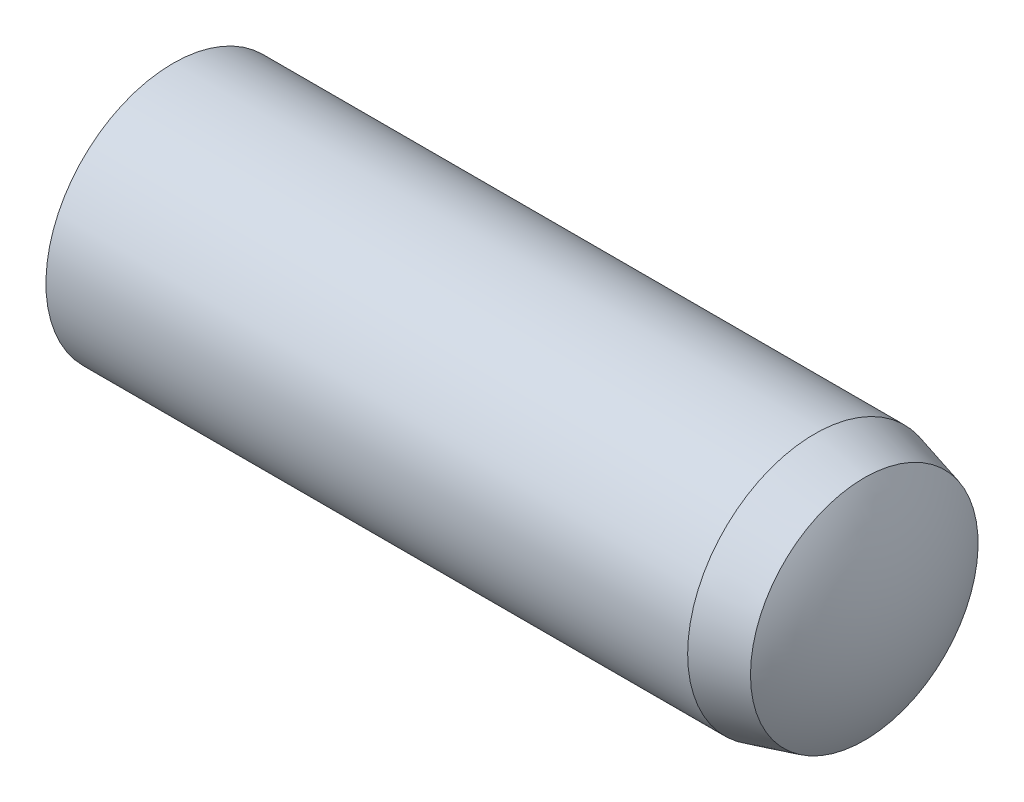
ISO-10303-21;
HEADER;
FILE_DESCRIPTION(('STEP AP214'),'2;1');
FILE_NAME('part.step','',(''),(''),'','','');
FILE_SCHEMA(('AUTOMOTIVE_DESIGN { 1 0 10303 214 1 1 1 1 }'));
ENDSEC;
DATA;
#1=APPLICATION_CONTEXT('core data for automotive mechanical design processes');
#2=APPLICATION_PROTOCOL_DEFINITION('international standard','automotive_design',2000,#1);
#3=PRODUCT_CONTEXT('',#1,'mechanical');
#4=PRODUCT('Part','Part','',(#3));
#5=PRODUCT_RELATED_PRODUCT_CATEGORY('part','',(#4));
#6=PRODUCT_DEFINITION_FORMATION('','',#4);
#7=PRODUCT_DEFINITION_CONTEXT('part definition',#1,'design');
#8=PRODUCT_DEFINITION('design','',#6,#7);
#9=PRODUCT_DEFINITION_SHAPE('','',#8);
#10=(LENGTH_UNIT() NAMED_UNIT(*) SI_UNIT(.MILLI.,.METRE.));
#11=(NAMED_UNIT(*) PLANE_ANGLE_UNIT() SI_UNIT($,.RADIAN.));
#12=(NAMED_UNIT(*) SI_UNIT($,.STERADIAN.) SOLID_ANGLE_UNIT());
#13=UNCERTAINTY_MEASURE_WITH_UNIT(LENGTH_MEASURE(1.E-05),#10,'distance_accuracy_value','');
#14=(GEOMETRIC_REPRESENTATION_CONTEXT(3) GLOBAL_UNCERTAINTY_ASSIGNED_CONTEXT((#13)) GLOBAL_UNIT_ASSIGNED_CONTEXT((#10,
#11,#12)) REPRESENTATION_CONTEXT('',''));
#15=CARTESIAN_POINT('',(0.,0.,0.));
#16=DIRECTION('',(0.,0.,1.));
#17=DIRECTION('',(1.,0.,0.));
#18=AXIS2_PLACEMENT_3D('',#15,#16,#17);
#19=CARTESIAN_POINT('',(-11.9999999999986,-2.05391259555654E-12,1.09634523681734E-12));
#20=DIRECTION('',(0.999999999999973,0.,0.));
#21=DIRECTION('',(0.,0.,-0.999999999999992));
#22=AXIS2_PLACEMENT_3D('',#19,#20,#21);
#23=CYLINDRICAL_SURFACE('',#22,4.);
#24=CARTESIAN_POINT('',(9.40000000000187,0.,4.02455846426619E-12));
#25=DIRECTION('',(-0.999999999999973,0.,0.));
#26=DIRECTION('',(0.,0.,0.999999999999992));
#27=AXIS2_PLACEMENT_3D('',#24,#25,#26);
#28=CIRCLE('',#27,3.99999999999999);
#29=CARTESIAN_POINT('',(9.40000000000187,-1.85989001977304E-12,-3.99999999999886));
#30=VERTEX_POINT('',#29);
#31=EDGE_CURVE('E11',#30,#30,#28,.T.);
#32=CARTESIAN_POINT('',(-10.7999999999991,-1.69309011255336E-12,1.22124532708767E-12));
#33=DIRECTION('',(-0.999999999999973,0.,0.));
#34=DIRECTION('',(0.,0.,0.999999999999992));
#35=AXIS2_PLACEMENT_3D('',#32,#33,#34);
#36=CIRCLE('',#35,4.);
#37=CARTESIAN_POINT('',(-10.7999999999991,-2.04827266259145E-12,-3.99999999999887));
#38=VERTEX_POINT('',#37);
#39=EDGE_CURVE('E54',#38,#38,#36,.T.);
#40=CARTESIAN_POINT('',(9.40000000000187,-1.85989001977304E-12,-3.99999999999886));
#41=CARTESIAN_POINT('',(9.1895833333352,-1.86185233896906E-12,-3.99999999999886));
#42=CARTESIAN_POINT('',(8.97916666666852,-1.86381465816509E-12,-3.99999999999886));
#43=CARTESIAN_POINT('',(8.55833333333517,-1.86773929655714E-12,-3.99999999999886));
#44=CARTESIAN_POINT('',(8.34791666666849,-1.86970161575316E-12,-3.99999999999886));
#45=CARTESIAN_POINT('',(7.92708333333514,-1.87362625414521E-12,-3.99999999999886));
#46=CARTESIAN_POINT('',(7.71666666666846,-1.87558857334124E-12,-3.99999999999886));
#47=CARTESIAN_POINT('',(7.29583333333511,-1.87951321173329E-12,-3.99999999999886));
#48=CARTESIAN_POINT('',(7.08541666666844,-1.88147553092931E-12,-3.99999999999886));
#49=CARTESIAN_POINT('',(6.66458333333508,-1.88540016932136E-12,-3.99999999999886));
#50=CARTESIAN_POINT('',(6.45416666666841,-1.88736248851739E-12,-3.99999999999886));
#51=CARTESIAN_POINT('',(6.03333333333505,-1.89128712690944E-12,-3.99999999999886));
#52=CARTESIAN_POINT('',(5.82291666666838,-1.89324944610546E-12,-3.99999999999886));
#53=CARTESIAN_POINT('',(5.40208333333502,-1.89717408449751E-12,-3.99999999999886));
#54=CARTESIAN_POINT('',(5.19166666666835,-1.89913640369354E-12,-3.99999999999886));
#55=CARTESIAN_POINT('',(4.77083333333499,-1.90306104208559E-12,-3.99999999999886));
#56=CARTESIAN_POINT('',(4.56041666666832,-1.90502336128161E-12,-3.99999999999886));
#57=CARTESIAN_POINT('',(4.13958333333496,-1.90894799967366E-12,-3.99999999999886));
#58=CARTESIAN_POINT('',(3.92916666666829,-1.91091031886969E-12,-3.99999999999886));
#59=CARTESIAN_POINT('',(3.50833333333494,-1.91483495726174E-12,-3.99999999999886));
#60=CARTESIAN_POINT('',(3.29791666666826,-1.91679727645776E-12,-3.99999999999886));
#61=CARTESIAN_POINT('',(2.87708333333491,-1.92072191484981E-12,-3.99999999999886));
#62=CARTESIAN_POINT('',(2.66666666666823,-1.92268423404584E-12,-3.99999999999886));
#63=CARTESIAN_POINT('',(2.24583333333488,-1.92660887243789E-12,-3.99999999999886));
#64=CARTESIAN_POINT('',(2.0354166666682,-1.92857119163392E-12,-3.99999999999886));
#65=CARTESIAN_POINT('',(1.61458333333485,-1.93249583002597E-12,-3.99999999999886));
#66=CARTESIAN_POINT('',(1.40416666666817,-1.93445814922199E-12,-3.99999999999886));
#67=CARTESIAN_POINT('',(0.983333333334823,-1.93838278761404E-12,-3.99999999999886));
#68=CARTESIAN_POINT('',(0.772916666668146,-1.94034510681007E-12,-3.99999999999886));
#69=CARTESIAN_POINT('',(0.352083333334794,-1.94426974520212E-12,-3.99999999999886));
#70=CARTESIAN_POINT('',(0.141666666668118,-1.94623206439814E-12,-3.99999999999886));
#71=CARTESIAN_POINT('',(-0.279166666665234,-1.95015670279019E-12,-3.99999999999886));
#72=CARTESIAN_POINT('',(-0.489583333331911,-1.95211902198622E-12,-3.99999999999886));
#73=CARTESIAN_POINT('',(-0.910416666665264,-1.95604366037827E-12,-3.99999999999886));
#74=CARTESIAN_POINT('',(-1.12083333333194,-1.95800597957429E-12,-3.99999999999886));
#75=CARTESIAN_POINT('',(-1.54166666666529,-1.96193061796634E-12,-3.99999999999886));
#76=CARTESIAN_POINT('',(-1.75208333333197,-1.96389293716237E-12,-3.99999999999887));
#77=CARTESIAN_POINT('',(-2.17291666666532,-1.96781757555442E-12,-3.99999999999887));
#78=CARTESIAN_POINT('',(-2.383333333332,-1.96977989475044E-12,-3.99999999999887));
#79=CARTESIAN_POINT('',(-2.80416666666535,-1.97370453314249E-12,-3.99999999999887));
#80=CARTESIAN_POINT('',(-3.01458333333203,-1.97566685233852E-12,-3.99999999999887));
#81=CARTESIAN_POINT('',(-3.43541666666538,-1.97959149073057E-12,-3.99999999999887));
#82=CARTESIAN_POINT('',(-3.64583333333206,-1.98155380992659E-12,-3.99999999999887));
#83=CARTESIAN_POINT('',(-4.06666666666541,-1.98547844831864E-12,-3.99999999999887));
#84=CARTESIAN_POINT('',(-4.27708333333208,-1.98744076751467E-12,-3.99999999999887));
#85=CARTESIAN_POINT('',(-4.69791666666544,-1.99136540590672E-12,-3.99999999999887));
#86=CARTESIAN_POINT('',(-4.90833333333211,-1.99332772510274E-12,-3.99999999999887));
#87=CARTESIAN_POINT('',(-5.32916666666547,-1.99725236349479E-12,-3.99999999999887));
#88=CARTESIAN_POINT('',(-5.53958333333214,-1.99921468269082E-12,-3.99999999999887));
#89=CARTESIAN_POINT('',(-5.96041666666549,-2.00313932108287E-12,-3.99999999999887));
#90=CARTESIAN_POINT('',(-6.17083333333217,-2.00510164027889E-12,-3.99999999999887));
#91=CARTESIAN_POINT('',(-6.59166666666552,-2.00902627867095E-12,-3.99999999999887));
#92=CARTESIAN_POINT('',(-6.8020833333322,-2.01098859786697E-12,-3.99999999999887));
#93=CARTESIAN_POINT('',(-7.22291666666555,-2.01491323625902E-12,-3.99999999999887));
#94=CARTESIAN_POINT('',(-7.43333333333223,-2.01687555545505E-12,-3.99999999999887));
#95=CARTESIAN_POINT('',(-7.85416666666558,-2.0208001938471E-12,-3.99999999999887));
#96=CARTESIAN_POINT('',(-8.06458333333226,-2.02276251304312E-12,-3.99999999999887));
#97=CARTESIAN_POINT('',(-8.48541666666561,-2.02668715143517E-12,-3.99999999999887));
#98=CARTESIAN_POINT('',(-8.69583333333228,-2.0286494706312E-12,-3.99999999999887));
#99=CARTESIAN_POINT('',(-9.11666666666564,-2.03257410902325E-12,-3.99999999999887));
#100=CARTESIAN_POINT('',(-9.32708333333231,-2.03453642821927E-12,-3.99999999999887));
#101=CARTESIAN_POINT('',(-9.74791666666567,-2.03846106661132E-12,-3.99999999999887));
#102=CARTESIAN_POINT('',(-9.95833333333235,-2.04042338580735E-12,-3.99999999999887));
#103=CARTESIAN_POINT('',(-10.3791666666657,-2.0443480241994E-12,-3.99999999999887));
#104=CARTESIAN_POINT('',(-10.5895833333324,-2.04631034339542E-12,-3.99999999999887));
#105=CARTESIAN_POINT('',(-10.7999999999991,-2.04827266259145E-12,-3.99999999999887));
#106=B_SPLINE_CURVE_WITH_KNOTS('',3,(#40,#41,#42,#43,#44,#45,#46,#47,#48,#49,#50,#51,#52,#53,
#54,#55,#56,#57,#58,#59,#60,#61,#62,#63,#64,#65,#66,#67,#68,#69,#70,#71,#72,#73,#74,#75,#76,#77,
#78,#79,#80,#81,#82,#83,#84,#85,#86,#87,#88,#89,#90,#91,#92,#93,#94,#95,#96,#97,#98,#99,#100,
#101,#102,#103,#104,#105),.UNSPECIFIED.,.F.,.F.,(4,2,2,2,2,2,2,2,2,2,2,2,2,2,2,2,2,2,2,2,2,2,2,
2,2,2,2,2,2,2,2,2,4),(0.,0.631250000000028,1.26250000000006,1.89375000000009,2.52500000000011,
3.15625000000014,3.78750000000018,4.4187500000002,5.05000000000023,5.68125000000026,
6.31250000000029,6.94375000000032,7.57500000000035,8.20625000000038,8.8375000000004,
9.46875000000043,10.1000000000005,10.7312500000005,11.3625000000005,11.9937500000005,
12.6250000000006,13.2562500000006,13.8875000000006,14.5187500000007,15.1500000000007,
15.7812500000007,16.4125000000008,17.0437500000008,17.6750000000008,18.3062500000008,
18.9375000000009,19.5687500000009,20.2000000000009),.UNSPECIFIED.);
#107=EDGE_CURVE('BSEAM34',#30,#38,#106,.T.);
#108=ORIENTED_EDGE('',*,*,#31,.T.);
#109=ORIENTED_EDGE('',*,*,#39,.F.);
#110=ORIENTED_EDGE('',*,*,#107,.T.);
#111=ORIENTED_EDGE('',*,*,#107,.F.);
#112=EDGE_LOOP('',(#108,#110,#109,#111));
#113=FACE_BOUND('',#112,.T.);
#114=ADVANCED_FACE('F34',(#113),#23,.T.);
#115=CARTESIAN_POINT('',(9.40000000000187,0.,4.02455846426619E-12));
#116=DIRECTION('',(-0.999999999999973,0.,0.));
#117=DIRECTION('',(0.,0.,0.999999999999992));
#118=AXIS2_PLACEMENT_3D('',#115,#116,#117);
#119=CONICAL_SURFACE('',#118,3.99999999999999,0.26179938779915);
#120=CARTESIAN_POINT('',(10.96,-1.80411241501588E-12,2.81719092498633E-12));
#121=DIRECTION('',(-0.999999999999973,0.,0.));
#122=DIRECTION('',(0.,0.,0.999999999999992));
#123=AXIS2_PLACEMENT_3D('',#120,#121,#122);
#124=CIRCLE('',#123,3.58199925980744);
#125=CARTESIAN_POINT('',(10.96,-1.79914139245034E-12,3.58199925981023));
#126=VERTEX_POINT('',#125);
#127=EDGE_CURVE('E41',#126,#126,#124,.T.);
#128=ORIENTED_EDGE('',*,*,#127,.T.);
#129=EDGE_LOOP('',(#128));
#130=FACE_BOUND('',#129,.T.);
#131=ORIENTED_EDGE('',*,*,#31,.F.);
#132=EDGE_LOOP('',(#131));
#133=FACE_BOUND('',#132,.T.);
#134=ADVANCED_FACE('F60',(#130,#133),#119,.T.);
#135=CARTESIAN_POINT('',(5.31138524170122,-1.85962356624714E-12,2.94209101525666E-12));
#136=DIRECTION('',(-0.999999999999973,0.,0.));
#137=DIRECTION('',(0.,0.999999999999997,0.));
#138=AXIS2_PLACEMENT_3D('',#135,#136,#137);
#139=SPHERICAL_SURFACE('',#138,6.68861475829853);
#140=CARTESIAN_POINT('',(11.9999999999989,-7.49400541621981E-13,1.31838984174237E-12));
#141=VERTEX_POINT('',#140);
#142=VERTEX_LOOP('',#141);
#143=FACE_BOUND('',#142,.T.);
#144=ORIENTED_EDGE('',*,*,#127,.F.);
#145=EDGE_LOOP('',(#144));
#146=FACE_BOUND('',#145,.T.);
#147=ADVANCED_FACE('F50',(#143,#146),#139,.T.);
#148=CARTESIAN_POINT('',(-4.73333333333359,-1.69309011255336E-12,2.17881268582687E-12));
#149=DIRECTION('',(-0.999999999999973,0.,0.));
#150=DIRECTION('',(0.,0.999999999999997,0.));
#151=AXIS2_PLACEMENT_3D('',#148,#149,#150);
#152=SPHERICAL_SURFACE('',#151,7.26666666666667);
#153=CARTESIAN_POINT('',(-11.9999999999986,-2.05391259555654E-12,1.09634523681734E-12));
#154=VERTEX_POINT('',#153);
#155=VERTEX_LOOP('',#154);
#156=FACE_BOUND('',#155,.T.);
#157=ORIENTED_EDGE('',*,*,#39,.T.);
#158=EDGE_LOOP('',(#157));
#159=FACE_BOUND('',#158,.T.);
#160=ADVANCED_FACE('F47',(#156,#159),#152,.T.);
#161=CLOSED_SHELL('',(#114,#134,#147,#160));
#162=MANIFOLD_SOLID_BREP('B2',#161);
#163=ADVANCED_BREP_SHAPE_REPRESENTATION('',(#18,#162),#14);
#164=SHAPE_DEFINITION_REPRESENTATION(#9,#163);
ENDSEC;
END-ISO-10303-21;
